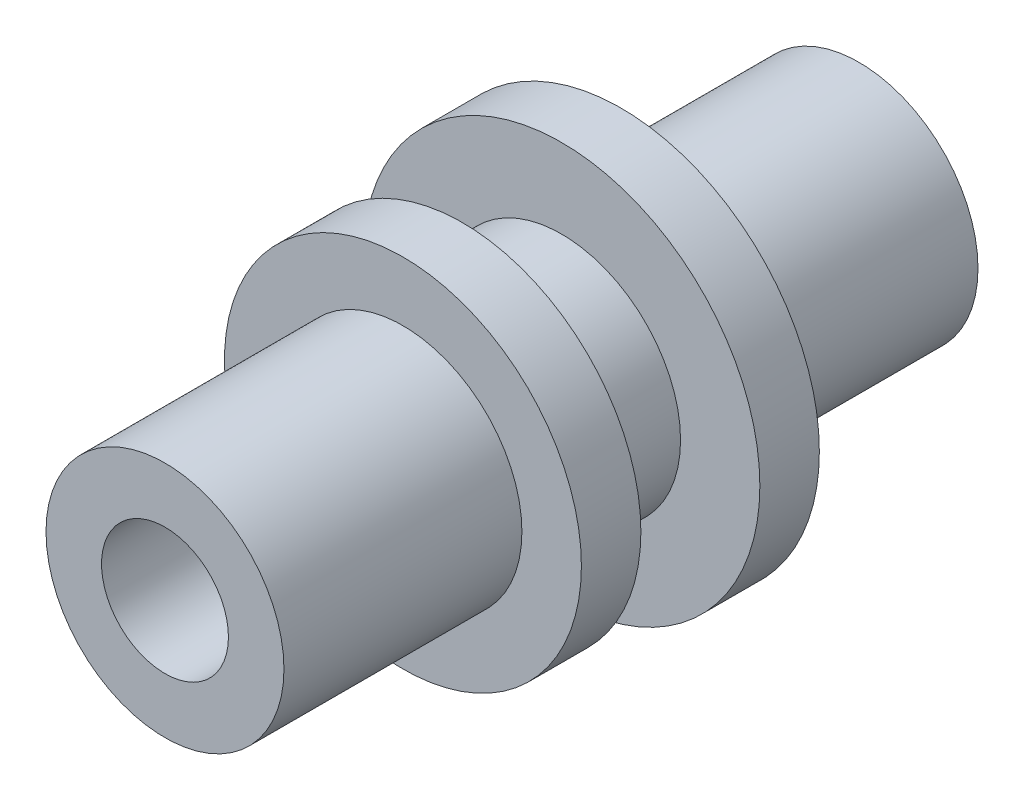
ISO-10303-21;
HEADER;
FILE_DESCRIPTION(('STEP AP214'),'2;1');
FILE_NAME('part.step','',(''),(''),'','','');
FILE_SCHEMA(('AUTOMOTIVE_DESIGN { 1 0 10303 214 1 1 1 1 }'));
ENDSEC;
DATA;
#1=APPLICATION_CONTEXT('core data for automotive mechanical design processes');
#2=APPLICATION_PROTOCOL_DEFINITION('international standard','automotive_design',2000,#1);
#3=PRODUCT_CONTEXT('',#1,'mechanical');
#4=PRODUCT('Part','Part','',(#3));
#5=PRODUCT_RELATED_PRODUCT_CATEGORY('part','',(#4));
#6=PRODUCT_DEFINITION_FORMATION('','',#4);
#7=PRODUCT_DEFINITION_CONTEXT('part definition',#1,'design');
#8=PRODUCT_DEFINITION('design','',#6,#7);
#9=PRODUCT_DEFINITION_SHAPE('','',#8);
#10=(LENGTH_UNIT() NAMED_UNIT(*) SI_UNIT(.MILLI.,.METRE.));
#11=(NAMED_UNIT(*) PLANE_ANGLE_UNIT() SI_UNIT($,.RADIAN.));
#12=(NAMED_UNIT(*) SI_UNIT($,.STERADIAN.) SOLID_ANGLE_UNIT());
#13=UNCERTAINTY_MEASURE_WITH_UNIT(LENGTH_MEASURE(1.E-05),#10,'distance_accuracy_value','');
#14=(GEOMETRIC_REPRESENTATION_CONTEXT(3) GLOBAL_UNCERTAINTY_ASSIGNED_CONTEXT((#13)) GLOBAL_UNIT_ASSIGNED_CONTEXT((#10,
#11,#12)) REPRESENTATION_CONTEXT('',''));
#15=CARTESIAN_POINT('',(0.,0.,0.));
#16=DIRECTION('',(0.,0.,1.));
#17=DIRECTION('',(1.,0.,0.));
#18=AXIS2_PLACEMENT_3D('',#15,#16,#17);
#19=CARTESIAN_POINT('',(0.,0.,0.));
#20=DIRECTION('',(0.,0.,-1.));
#21=DIRECTION('',(-1.,0.,0.));
#22=AXIS2_PLACEMENT_3D('',#19,#20,#21);
#23=CYLINDRICAL_SURFACE('',#22,10.);
#24=CARTESIAN_POINT('',(0.,0.,0.));
#25=DIRECTION('',(0.,0.,1.));
#26=DIRECTION('',(1.,0.,0.));
#27=AXIS2_PLACEMENT_3D('',#24,#25,#26);
#28=CIRCLE('',#27,10.);
#29=CARTESIAN_POINT('',(10.,0.,0.));
#30=VERTEX_POINT('',#29);
#31=EDGE_CURVE('E60',#30,#30,#28,.T.);
#32=ORIENTED_EDGE('',*,*,#31,.F.);
#33=EDGE_LOOP('',(#32));
#34=FACE_BOUND('',#33,.T.);
#35=CARTESIAN_POINT('',(0.,0.,-3.));
#36=DIRECTION('',(0.,0.,1.));
#37=DIRECTION('',(1.,0.,0.));
#38=AXIS2_PLACEMENT_3D('',#35,#36,#37);
#39=CIRCLE('',#38,10.);
#40=CARTESIAN_POINT('',(10.,0.,-3.));
#41=VERTEX_POINT('',#40);
#42=EDGE_CURVE('E46',#41,#41,#39,.T.);
#43=ORIENTED_EDGE('',*,*,#42,.T.);
#44=EDGE_LOOP('',(#43));
#45=FACE_BOUND('',#44,.T.);
#46=ADVANCED_FACE('F43',(#34,#45),#23,.T.);
#47=CARTESIAN_POINT('',(0.,0.,0.));
#48=DIRECTION('',(0.,0.,1.));
#49=DIRECTION('',(1.,0.,0.));
#50=AXIS2_PLACEMENT_3D('',#47,#48,#49);
#51=PLANE('',#50);
#52=CARTESIAN_POINT('',(0.,0.,0.));
#53=DIRECTION('',(0.,0.,1.));
#54=DIRECTION('',(1.,0.,0.));
#55=AXIS2_PLACEMENT_3D('',#52,#53,#54);
#56=CIRCLE('',#55,6.);
#57=CARTESIAN_POINT('',(6.,0.,0.));
#58=VERTEX_POINT('',#57);
#59=EDGE_CURVE('E51',#58,#58,#56,.T.);
#60=ORIENTED_EDGE('',*,*,#59,.F.);
#61=EDGE_LOOP('',(#60));
#62=FACE_BOUND('',#61,.T.);
#63=ORIENTED_EDGE('',*,*,#31,.T.);
#64=EDGE_LOOP('',(#63));
#65=FACE_BOUND('',#64,.T.);
#66=ADVANCED_FACE('F88',(#62,#65),#51,.T.);
#67=CARTESIAN_POINT('',(0.,0.,-3.));
#68=DIRECTION('',(0.,0.,1.));
#69=DIRECTION('',(1.,0.,0.));
#70=AXIS2_PLACEMENT_3D('',#67,#68,#69);
#71=PLANE('',#70);
#72=CARTESIAN_POINT('',(0.,0.,-3.));
#73=DIRECTION('',(0.,0.,1.));
#74=DIRECTION('',(1.,0.,0.));
#75=AXIS2_PLACEMENT_3D('',#72,#73,#74);
#76=CIRCLE('',#75,6.);
#77=CARTESIAN_POINT('',(6.,0.,-3.));
#78=VERTEX_POINT('',#77);
#79=EDGE_CURVE('E229',#78,#78,#76,.T.);
#80=ORIENTED_EDGE('',*,*,#79,.T.);
#81=EDGE_LOOP('',(#80));
#82=FACE_BOUND('',#81,.T.);
#83=ORIENTED_EDGE('',*,*,#42,.F.);
#84=EDGE_LOOP('',(#83));
#85=FACE_BOUND('',#84,.T.);
#86=ADVANCED_FACE('F83',(#82,#85),#71,.F.);
#87=CARTESIAN_POINT('',(0.,0.,5.));
#88=DIRECTION('',(0.,0.,-1.));
#89=DIRECTION('',(-1.,0.,0.));
#90=AXIS2_PLACEMENT_3D('',#87,#88,#89);
#91=CYLINDRICAL_SURFACE('',#90,6.);
#92=CARTESIAN_POINT('',(0.,0.,5.));
#93=DIRECTION('',(0.,0.,1.));
#94=DIRECTION('',(1.,0.,0.));
#95=AXIS2_PLACEMENT_3D('',#92,#93,#94);
#96=CIRCLE('',#95,6.);
#97=CARTESIAN_POINT('',(6.,0.,5.));
#98=VERTEX_POINT('',#97);
#99=EDGE_CURVE('E70',#98,#98,#96,.T.);
#100=ORIENTED_EDGE('',*,*,#99,.F.);
#101=EDGE_LOOP('',(#100));
#102=FACE_BOUND('',#101,.T.);
#103=ORIENTED_EDGE('',*,*,#59,.T.);
#104=EDGE_LOOP('',(#103));
#105=FACE_BOUND('',#104,.T.);
#106=ADVANCED_FACE('F81',(#102,#105),#91,.T.);
#107=CARTESIAN_POINT('',(0.,0.,8.));
#108=DIRECTION('',(0.,0.,-1.));
#109=DIRECTION('',(-1.,0.,0.));
#110=AXIS2_PLACEMENT_3D('',#107,#108,#109);
#111=CYLINDRICAL_SURFACE('',#110,9.);
#112=CARTESIAN_POINT('',(0.,0.,8.));
#113=DIRECTION('',(0.,0.,1.));
#114=DIRECTION('',(1.,0.,0.));
#115=AXIS2_PLACEMENT_3D('',#112,#113,#114);
#116=CIRCLE('',#115,9.);
#117=CARTESIAN_POINT('',(9.,0.,8.));
#118=VERTEX_POINT('',#117);
#119=EDGE_CURVE('E64',#118,#118,#116,.T.);
#120=ORIENTED_EDGE('',*,*,#119,.F.);
#121=EDGE_LOOP('',(#120));
#122=FACE_BOUND('',#121,.T.);
#123=CARTESIAN_POINT('',(0.,0.,5.));
#124=DIRECTION('',(0.,0.,1.));
#125=DIRECTION('',(1.,0.,0.));
#126=AXIS2_PLACEMENT_3D('',#123,#124,#125);
#127=CIRCLE('',#126,9.);
#128=CARTESIAN_POINT('',(9.,0.,5.));
#129=VERTEX_POINT('',#128);
#130=EDGE_CURVE('E68',#129,#129,#127,.T.);
#131=ORIENTED_EDGE('',*,*,#130,.T.);
#132=EDGE_LOOP('',(#131));
#133=FACE_BOUND('',#132,.T.);
#134=ADVANCED_FACE('F91',(#122,#133),#111,.T.);
#135=CARTESIAN_POINT('',(0.,0.,8.));
#136=DIRECTION('',(0.,0.,1.));
#137=DIRECTION('',(1.,0.,0.));
#138=AXIS2_PLACEMENT_3D('',#135,#136,#137);
#139=PLANE('',#138);
#140=CARTESIAN_POINT('',(0.,0.,8.));
#141=DIRECTION('',(0.,0.,1.));
#142=DIRECTION('',(1.,0.,0.));
#143=AXIS2_PLACEMENT_3D('',#140,#141,#142);
#144=CIRCLE('',#143,6.);
#145=CARTESIAN_POINT('',(6.,0.,8.));
#146=VERTEX_POINT('',#145);
#147=EDGE_CURVE('E10',#146,#146,#144,.T.);
#148=ORIENTED_EDGE('',*,*,#147,.F.);
#149=EDGE_LOOP('',(#148));
#150=FACE_BOUND('',#149,.T.);
#151=ORIENTED_EDGE('',*,*,#119,.T.);
#152=EDGE_LOOP('',(#151));
#153=FACE_BOUND('',#152,.T.);
#154=ADVANCED_FACE('F122',(#150,#153),#139,.T.);
#155=CARTESIAN_POINT('',(0.,0.,5.));
#156=DIRECTION('',(0.,0.,1.));
#157=DIRECTION('',(1.,0.,0.));
#158=AXIS2_PLACEMENT_3D('',#155,#156,#157);
#159=PLANE('',#158);
#160=ORIENTED_EDGE('',*,*,#99,.T.);
#161=EDGE_LOOP('',(#160));
#162=FACE_BOUND('',#161,.T.);
#163=ORIENTED_EDGE('',*,*,#130,.F.);
#164=EDGE_LOOP('',(#163));
#165=FACE_BOUND('',#164,.T.);
#166=ADVANCED_FACE('F126',(#162,#165),#159,.F.);
#167=CARTESIAN_POINT('',(0.,0.,20.));
#168=DIRECTION('',(0.,0.,-1.));
#169=DIRECTION('',(-1.,0.,0.));
#170=AXIS2_PLACEMENT_3D('',#167,#168,#169);
#171=CYLINDRICAL_SURFACE('',#170,6.);
#172=CARTESIAN_POINT('',(0.,0.,20.));
#173=DIRECTION('',(0.,0.,1.));
#174=DIRECTION('',(1.,0.,0.));
#175=AXIS2_PLACEMENT_3D('',#172,#173,#174);
#176=CIRCLE('',#175,6.);
#177=CARTESIAN_POINT('',(6.,0.,20.));
#178=VERTEX_POINT('',#177);
#179=EDGE_CURVE('E61',#178,#178,#176,.T.);
#180=ORIENTED_EDGE('',*,*,#179,.F.);
#181=EDGE_LOOP('',(#180));
#182=FACE_BOUND('',#181,.T.);
#183=ORIENTED_EDGE('',*,*,#147,.T.);
#184=EDGE_LOOP('',(#183));
#185=FACE_BOUND('',#184,.T.);
#186=ADVANCED_FACE('F132',(#182,#185),#171,.T.);
#187=CARTESIAN_POINT('',(0.,0.,20.));
#188=DIRECTION('',(0.,0.,1.));
#189=DIRECTION('',(1.,0.,0.));
#190=AXIS2_PLACEMENT_3D('',#187,#188,#189);
#191=PLANE('',#190);
#192=CARTESIAN_POINT('',(0.,0.,20.));
#193=DIRECTION('',(0.,0.,1.));
#194=DIRECTION('',(1.,0.,0.));
#195=AXIS2_PLACEMENT_3D('',#192,#193,#194);
#196=CIRCLE('',#195,3.2);
#197=CARTESIAN_POINT('',(3.2,0.,20.));
#198=VERTEX_POINT('',#197);
#199=EDGE_CURVE('E234',#198,#198,#196,.T.);
#200=ORIENTED_EDGE('',*,*,#199,.F.);
#201=EDGE_LOOP('',(#200));
#202=FACE_BOUND('',#201,.T.);
#203=ORIENTED_EDGE('',*,*,#179,.T.);
#204=EDGE_LOOP('',(#203));
#205=FACE_BOUND('',#204,.T.);
#206=ADVANCED_FACE('F146',(#202,#205),#191,.T.);
#207=CARTESIAN_POINT('',(0.,0.,10.));
#208=DIRECTION('',(0.,0.,1.));
#209=DIRECTION('',(1.,0.,0.));
#210=AXIS2_PLACEMENT_3D('',#207,#208,#209);
#211=CYLINDRICAL_SURFACE('',#210,3.2);
#212=CARTESIAN_POINT('',(0.,0.,10.));
#213=DIRECTION('',(0.,0.,1.));
#214=DIRECTION('',(1.,0.,0.));
#215=AXIS2_PLACEMENT_3D('',#212,#213,#214);
#216=CIRCLE('',#215,3.2);
#217=CARTESIAN_POINT('',(3.2,0.,10.));
#218=VERTEX_POINT('',#217);
#219=EDGE_CURVE('E237',#218,#218,#216,.T.);
#220=ORIENTED_EDGE('',*,*,#219,.F.);
#221=EDGE_LOOP('',(#220));
#222=FACE_BOUND('',#221,.T.);
#223=ORIENTED_EDGE('',*,*,#199,.T.);
#224=EDGE_LOOP('',(#223));
#225=FACE_BOUND('',#224,.T.);
#226=ADVANCED_FACE('F160',(#222,#225),#211,.F.);
#227=CARTESIAN_POINT('',(0.,0.,10.));
#228=DIRECTION('',(0.,0.,1.));
#229=DIRECTION('',(1.,0.,0.));
#230=AXIS2_PLACEMENT_3D('',#227,#228,#229);
#231=PLANE('',#230);
#232=ORIENTED_EDGE('',*,*,#219,.T.);
#233=EDGE_LOOP('',(#232));
#234=FACE_BOUND('',#233,.T.);
#235=ADVANCED_FACE('F164',(#234),#231,.T.);
#236=CARTESIAN_POINT('',(0.,0.,-3.));
#237=DIRECTION('',(0.,0.,-1.));
#238=DIRECTION('',(-1.,0.,0.));
#239=AXIS2_PLACEMENT_3D('',#236,#237,#238);
#240=CYLINDRICAL_SURFACE('',#239,6.);
#241=ORIENTED_EDGE('',*,*,#79,.F.);
#242=EDGE_LOOP('',(#241));
#243=FACE_BOUND('',#242,.T.);
#244=CARTESIAN_POINT('',(0.,0.,-15.));
#245=DIRECTION('',(0.,0.,1.));
#246=DIRECTION('',(1.,0.,0.));
#247=AXIS2_PLACEMENT_3D('',#244,#245,#246);
#248=CIRCLE('',#247,6.);
#249=CARTESIAN_POINT('',(6.,0.,-15.));
#250=VERTEX_POINT('',#249);
#251=EDGE_CURVE('E225',#250,#250,#248,.T.);
#252=ORIENTED_EDGE('',*,*,#251,.T.);
#253=EDGE_LOOP('',(#252));
#254=FACE_BOUND('',#253,.T.);
#255=ADVANCED_FACE('F174',(#243,#254),#240,.T.);
#256=CARTESIAN_POINT('',(0.,0.,-15.));
#257=DIRECTION('',(0.,0.,1.));
#258=DIRECTION('',(1.,0.,0.));
#259=AXIS2_PLACEMENT_3D('',#256,#257,#258);
#260=PLANE('',#259);
#261=CARTESIAN_POINT('',(0.,0.,-15.));
#262=DIRECTION('',(0.,0.,1.));
#263=DIRECTION('',(1.,0.,0.));
#264=AXIS2_PLACEMENT_3D('',#261,#262,#263);
#265=CIRCLE('',#264,3.2);
#266=CARTESIAN_POINT('',(3.2,0.,-15.));
#267=VERTEX_POINT('',#266);
#268=EDGE_CURVE('E224',#267,#267,#265,.T.);
#269=ORIENTED_EDGE('',*,*,#268,.T.);
#270=EDGE_LOOP('',(#269));
#271=FACE_BOUND('',#270,.T.);
#272=ORIENTED_EDGE('',*,*,#251,.F.);
#273=EDGE_LOOP('',(#272));
#274=FACE_BOUND('',#273,.T.);
#275=ADVANCED_FACE('F183',(#271,#274),#260,.F.);
#276=CARTESIAN_POINT('',(0.,0.,-5.));
#277=DIRECTION('',(0.,0.,-1.));
#278=DIRECTION('',(-1.,0.,0.));
#279=AXIS2_PLACEMENT_3D('',#276,#277,#278);
#280=CYLINDRICAL_SURFACE('',#279,3.2);
#281=CARTESIAN_POINT('',(0.,0.,-5.));
#282=DIRECTION('',(0.,0.,1.));
#283=DIRECTION('',(1.,0.,0.));
#284=AXIS2_PLACEMENT_3D('',#281,#282,#283);
#285=CIRCLE('',#284,3.2);
#286=CARTESIAN_POINT('',(3.2,0.,-5.));
#287=VERTEX_POINT('',#286);
#288=EDGE_CURVE('E219',#287,#287,#285,.T.);
#289=ORIENTED_EDGE('',*,*,#288,.T.);
#290=EDGE_LOOP('',(#289));
#291=FACE_BOUND('',#290,.T.);
#292=ORIENTED_EDGE('',*,*,#268,.F.);
#293=EDGE_LOOP('',(#292));
#294=FACE_BOUND('',#293,.T.);
#295=ADVANCED_FACE('F191',(#291,#294),#280,.F.);
#296=CARTESIAN_POINT('',(0.,0.,-5.));
#297=DIRECTION('',(0.,0.,1.));
#298=DIRECTION('',(1.,0.,0.));
#299=AXIS2_PLACEMENT_3D('',#296,#297,#298);
#300=PLANE('',#299);
#301=ORIENTED_EDGE('',*,*,#288,.F.);
#302=EDGE_LOOP('',(#301));
#303=FACE_BOUND('',#302,.T.);
#304=ADVANCED_FACE('F202',(#303),#300,.F.);
#305=CLOSED_SHELL('',(#46,#66,#86,#106,#134,#154,#166,#186,#206,#226,#235,#255,#275,#295,#304));
#306=MANIFOLD_SOLID_BREP('B2',#305);
#307=ADVANCED_BREP_SHAPE_REPRESENTATION('',(#18,#306),#14);
#308=SHAPE_DEFINITION_REPRESENTATION(#9,#307);
ENDSEC;
END-ISO-10303-21;
